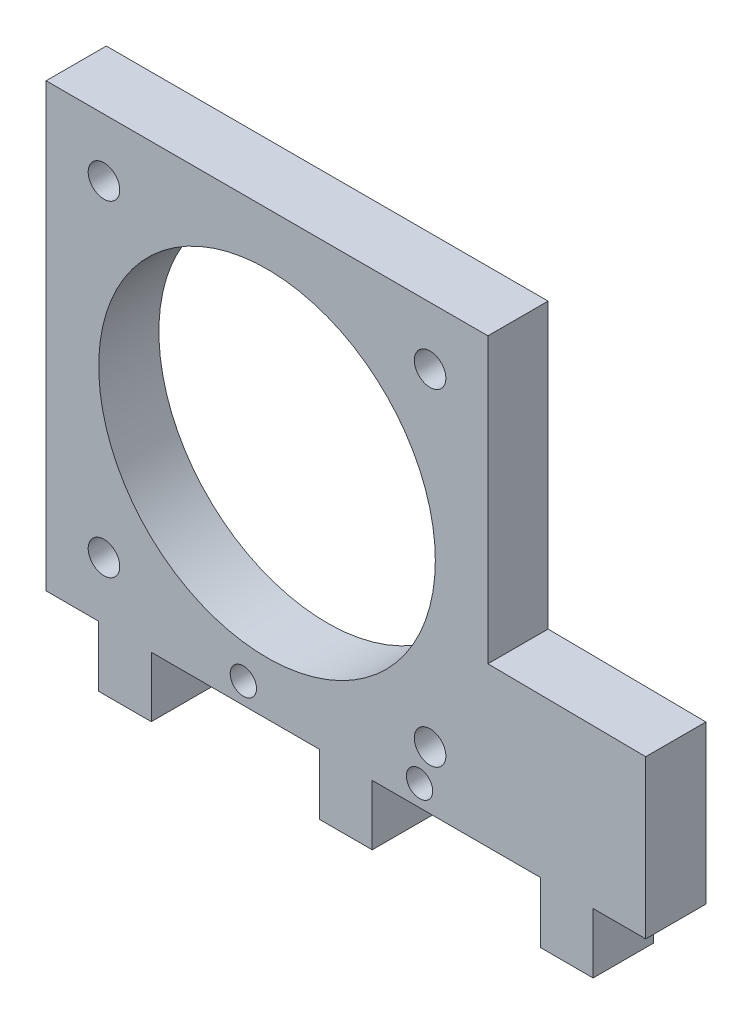
ISO-10303-21;
HEADER;
FILE_DESCRIPTION(('STEP AP214'),'2;1');
FILE_NAME('part.step','',(''),(''),'','','');
FILE_SCHEMA(('AUTOMOTIVE_DESIGN { 1 0 10303 214 1 1 1 1 }'));
ENDSEC;
DATA;
#1=APPLICATION_CONTEXT('core data for automotive mechanical design processes');
#2=APPLICATION_PROTOCOL_DEFINITION('international standard','automotive_design',2000,#1);
#3=PRODUCT_CONTEXT('',#1,'mechanical');
#4=PRODUCT('Part','Part','',(#3));
#5=PRODUCT_RELATED_PRODUCT_CATEGORY('part','',(#4));
#6=PRODUCT_DEFINITION_FORMATION('','',#4);
#7=PRODUCT_DEFINITION_CONTEXT('part definition',#1,'design');
#8=PRODUCT_DEFINITION('design','',#6,#7);
#9=PRODUCT_DEFINITION_SHAPE('','',#8);
#10=(LENGTH_UNIT() NAMED_UNIT(*) SI_UNIT(.MILLI.,.METRE.));
#11=(NAMED_UNIT(*) PLANE_ANGLE_UNIT() SI_UNIT($,.RADIAN.));
#12=(NAMED_UNIT(*) SI_UNIT($,.STERADIAN.) SOLID_ANGLE_UNIT());
#13=UNCERTAINTY_MEASURE_WITH_UNIT(LENGTH_MEASURE(1.E-05),#10,'distance_accuracy_value','');
#14=(GEOMETRIC_REPRESENTATION_CONTEXT(3) GLOBAL_UNCERTAINTY_ASSIGNED_CONTEXT((#13)) GLOBAL_UNIT_ASSIGNED_CONTEXT((#10,
#11,#12)) REPRESENTATION_CONTEXT('',''));
#15=CARTESIAN_POINT('',(0.,0.,0.));
#16=DIRECTION('',(0.,0.,1.));
#17=DIRECTION('',(1.,0.,0.));
#18=AXIS2_PLACEMENT_3D('',#15,#16,#17);
#19=CARTESIAN_POINT('',(0.,0.,5.72));
#20=DIRECTION('',(0.,0.,1.));
#21=DIRECTION('',(1.,0.,0.));
#22=AXIS2_PLACEMENT_3D('',#19,#20,#21);
#23=PLANE('',#22);
#24=CARTESIAN_POINT('',(-27.12,26.6479389312977,5.72));
#25=DIRECTION('',(0.,0.,1.));
#26=DIRECTION('',(1.,0.,0.));
#27=AXIS2_PLACEMENT_3D('',#24,#25,#26);
#28=CIRCLE('',#27,1.5);
#29=CARTESIAN_POINT('',(-25.62,26.6479389312977,5.72));
#30=VERTEX_POINT('',#29);
#31=EDGE_CURVE('E381',#30,#30,#28,.T.);
#32=ORIENTED_EDGE('',*,*,#31,.F.);
#33=EDGE_LOOP('',(#32));
#34=FACE_BOUND('',#33,.T.);
#35=CARTESIAN_POINT('',(-13.87,-7.90137404580153,5.72));
#36=DIRECTION('',(0.,0.,1.));
#37=DIRECTION('',(1.,0.,0.));
#38=AXIS2_PLACEMENT_3D('',#35,#36,#37);
#39=CIRCLE('',#38,1.25);
#40=CARTESIAN_POINT('',(-12.62,-7.90137404580153,5.72));
#41=VERTEX_POINT('',#40);
#42=EDGE_CURVE('E393',#41,#41,#39,.T.);
#43=ORIENTED_EDGE('',*,*,#42,.F.);
#44=EDGE_LOOP('',(#43));
#45=FACE_BOUND('',#44,.T.);
#46=CARTESIAN_POINT('',(3.87984311123458,-4.45068702290077,5.72));
#47=DIRECTION('',(0.,0.,1.));
#48=DIRECTION('',(1.,0.,0.));
#49=AXIS2_PLACEMENT_3D('',#46,#47,#48);
#50=CIRCLE('',#49,1.5);
#51=CARTESIAN_POINT('',(5.37984311123458,-4.45068702290077,5.72));
#52=VERTEX_POINT('',#51);
#53=EDGE_CURVE('E405',#52,#52,#50,.T.);
#54=ORIENTED_EDGE('',*,*,#53,.F.);
#55=EDGE_LOOP('',(#54));
#56=FACE_BOUND('',#55,.T.);
#57=DIRECTION('',(-0.999951368153607,0.00986211578362053,0.));
#58=VECTOR('',#57,1.);
#59=CARTESIAN_POINT('',(9.38,5.14793893129769,5.72));
#60=LINE('',#59,#58);
#61=CARTESIAN_POINT('',(24.38,5.,5.72));
#62=VERTEX_POINT('',#61);
#63=CARTESIAN_POINT('',(9.38,5.14793893129769,5.72));
#64=VERTEX_POINT('',#63);
#65=EDGE_CURVE('E225',#62,#64,#60,.T.);
#66=ORIENTED_EDGE('',*,*,#65,.T.);
#67=DIRECTION('',(0.,1.,0.));
#68=VECTOR('',#67,1.);
#69=CARTESIAN_POINT('',(9.38,32.1479389312977,5.72));
#70=LINE('',#69,#68);
#71=CARTESIAN_POINT('',(9.38,32.1479389312977,5.72));
#72=VERTEX_POINT('',#71);
#73=EDGE_CURVE('E123',#64,#72,#70,.T.);
#74=ORIENTED_EDGE('',*,*,#73,.T.);
#75=DIRECTION('',(-1.,0.,0.));
#76=VECTOR('',#75,1.);
#77=CARTESIAN_POINT('',(-32.62,32.1479389312977,5.72));
#78=LINE('',#77,#76);
#79=CARTESIAN_POINT('',(-32.62,32.1479389312977,5.72));
#80=VERTEX_POINT('',#79);
#81=EDGE_CURVE('E270',#72,#80,#78,.T.);
#82=ORIENTED_EDGE('',*,*,#81,.T.);
#83=DIRECTION('',(0.,-1.,0.));
#84=VECTOR('',#83,1.);
#85=CARTESIAN_POINT('',(-32.62,-9.85206106870231,5.72));
#86=LINE('',#85,#84);
#87=CARTESIAN_POINT('',(-32.62,-9.85206106870231,5.72));
#88=VERTEX_POINT('',#87);
#89=EDGE_CURVE('E289',#80,#88,#86,.T.);
#90=ORIENTED_EDGE('',*,*,#89,.T.);
#91=DIRECTION('',(1.,0.,0.));
#92=VECTOR('',#91,1.);
#93=CARTESIAN_POINT('',(-27.62,-9.85206106870231,5.72));
#94=LINE('',#93,#92);
#95=CARTESIAN_POINT('',(-27.62,-9.85206106870231,5.72));
#96=VERTEX_POINT('',#95);
#97=EDGE_CURVE('E286',#88,#96,#94,.T.);
#98=ORIENTED_EDGE('',*,*,#97,.T.);
#99=DIRECTION('',(0.,-1.,0.));
#100=VECTOR('',#99,1.);
#101=CARTESIAN_POINT('',(-27.62,-15.6213740458015,5.72));
#102=LINE('',#101,#100);
#103=CARTESIAN_POINT('',(-27.62,-15.6213740458015,5.72));
#104=VERTEX_POINT('',#103);
#105=EDGE_CURVE('E288',#96,#104,#102,.T.);
#106=ORIENTED_EDGE('',*,*,#105,.T.);
#107=DIRECTION('',(1.,0.,0.));
#108=VECTOR('',#107,1.);
#109=CARTESIAN_POINT('',(-22.62,-15.6213740458015,5.72));
#110=LINE('',#109,#108);
#111=CARTESIAN_POINT('',(-22.62,-15.6213740458015,5.72));
#112=VERTEX_POINT('',#111);
#113=EDGE_CURVE('E291',#104,#112,#110,.T.);
#114=ORIENTED_EDGE('',*,*,#113,.T.);
#115=DIRECTION('',(0.,1.,0.));
#116=VECTOR('',#115,1.);
#117=CARTESIAN_POINT('',(-22.62,-9.90137404580153,5.72));
#118=LINE('',#117,#116);
#119=CARTESIAN_POINT('',(-22.62,-9.90137404580153,5.72));
#120=VERTEX_POINT('',#119);
#121=EDGE_CURVE('E297',#112,#120,#118,.T.);
#122=ORIENTED_EDGE('',*,*,#121,.T.);
#123=DIRECTION('',(1.,0.,0.));
#124=VECTOR('',#123,1.);
#125=CARTESIAN_POINT('',(-6.62,-9.90137404580153,5.72));
#126=LINE('',#125,#124);
#127=CARTESIAN_POINT('',(-6.62,-9.90137404580153,5.72));
#128=VERTEX_POINT('',#127);
#129=EDGE_CURVE('E299',#120,#128,#126,.T.);
#130=ORIENTED_EDGE('',*,*,#129,.T.);
#131=DIRECTION('',(0.,-1.,0.));
#132=VECTOR('',#131,1.);
#133=CARTESIAN_POINT('',(-6.62,-15.6706870229008,5.72));
#134=LINE('',#133,#132);
#135=CARTESIAN_POINT('',(-6.62,-15.6706870229008,5.72));
#136=VERTEX_POINT('',#135);
#137=EDGE_CURVE('E301',#128,#136,#134,.T.);
#138=ORIENTED_EDGE('',*,*,#137,.T.);
#139=DIRECTION('',(1.,0.,0.));
#140=VECTOR('',#139,1.);
#141=CARTESIAN_POINT('',(-1.62,-15.6706870229008,5.72));
#142=LINE('',#141,#140);
#143=CARTESIAN_POINT('',(-1.62,-15.6706870229008,5.72));
#144=VERTEX_POINT('',#143);
#145=EDGE_CURVE('E303',#136,#144,#142,.T.);
#146=ORIENTED_EDGE('',*,*,#145,.T.);
#147=DIRECTION('',(0.,1.,0.));
#148=VECTOR('',#147,1.);
#149=CARTESIAN_POINT('',(-1.62,-9.95068702290077,5.72));
#150=LINE('',#149,#148);
#151=CARTESIAN_POINT('',(-1.62,-9.95068702290077,5.72));
#152=VERTEX_POINT('',#151);
#153=EDGE_CURVE('E305',#144,#152,#150,.T.);
#154=ORIENTED_EDGE('',*,*,#153,.T.);
#155=DIRECTION('',(1.,0.,0.));
#156=VECTOR('',#155,1.);
#157=CARTESIAN_POINT('',(14.38,-9.95068702290077,5.72));
#158=LINE('',#157,#156);
#159=CARTESIAN_POINT('',(14.38,-9.95068702290077,5.72));
#160=VERTEX_POINT('',#159);
#161=EDGE_CURVE('E307',#152,#160,#158,.T.);
#162=ORIENTED_EDGE('',*,*,#161,.T.);
#163=DIRECTION('',(0.,-1.,0.));
#164=VECTOR('',#163,1.);
#165=CARTESIAN_POINT('',(14.38,-15.72,5.72));
#166=LINE('',#165,#164);
#167=CARTESIAN_POINT('',(14.38,-15.72,5.72));
#168=VERTEX_POINT('',#167);
#169=EDGE_CURVE('E309',#160,#168,#166,.T.);
#170=ORIENTED_EDGE('',*,*,#169,.T.);
#171=DIRECTION('',(1.,0.,0.));
#172=VECTOR('',#171,1.);
#173=CARTESIAN_POINT('',(19.38,-15.72,5.72));
#174=LINE('',#173,#172);
#175=CARTESIAN_POINT('',(19.38,-15.72,5.72));
#176=VERTEX_POINT('',#175);
#177=EDGE_CURVE('E172',#168,#176,#174,.T.);
#178=ORIENTED_EDGE('',*,*,#177,.T.);
#179=DIRECTION('',(0.,1.,0.));
#180=VECTOR('',#179,1.);
#181=CARTESIAN_POINT('',(19.38,-10.,5.72));
#182=LINE('',#181,#180);
#183=CARTESIAN_POINT('',(19.38,-10.,5.72));
#184=VERTEX_POINT('',#183);
#185=EDGE_CURVE('E166',#176,#184,#182,.T.);
#186=ORIENTED_EDGE('',*,*,#185,.T.);
#187=DIRECTION('',(1.,0.,0.));
#188=VECTOR('',#187,1.);
#189=CARTESIAN_POINT('',(24.38,-10.,5.72));
#190=LINE('',#189,#188);
#191=CARTESIAN_POINT('',(24.38,-10.,5.72));
#192=VERTEX_POINT('',#191);
#193=EDGE_CURVE('E170',#184,#192,#190,.T.);
#194=ORIENTED_EDGE('',*,*,#193,.T.);
#195=DIRECTION('',(0.,1.,0.));
#196=VECTOR('',#195,1.);
#197=CARTESIAN_POINT('',(24.38,-10.,5.72));
#198=LINE('',#197,#196);
#199=EDGE_CURVE('E50',#192,#62,#198,.T.);
#200=ORIENTED_EDGE('',*,*,#199,.T.);
#201=EDGE_LOOP('',(#66,#74,#82,#90,#98,#106,#114,#122,#130,#138,#146,#154,#162,#170,#178,#186,
#194,#200));
#202=FACE_BOUND('',#201,.T.);
#203=CARTESIAN_POINT('',(-11.62,11.1479389312977,5.72));
#204=DIRECTION('',(0.,0.,1.));
#205=DIRECTION('',(1.,0.,0.));
#206=AXIS2_PLACEMENT_3D('',#203,#204,#205);
#207=CIRCLE('',#206,16.);
#208=CARTESIAN_POINT('',(4.38,11.1479389312977,5.72));
#209=VERTEX_POINT('',#208);
#210=EDGE_CURVE('E194',#209,#209,#207,.T.);
#211=ORIENTED_EDGE('',*,*,#210,.F.);
#212=EDGE_LOOP('',(#211));
#213=FACE_BOUND('',#212,.T.);
#214=CARTESIAN_POINT('',(2.88,-7.95068702290077,5.72));
#215=DIRECTION('',(0.,0.,1.));
#216=DIRECTION('',(1.,0.,0.));
#217=AXIS2_PLACEMENT_3D('',#214,#215,#216);
#218=CIRCLE('',#217,1.25);
#219=CARTESIAN_POINT('',(4.13,-7.95068702290077,5.72));
#220=VERTEX_POINT('',#219);
#221=EDGE_CURVE('E399',#220,#220,#218,.T.);
#222=ORIENTED_EDGE('',*,*,#221,.F.);
#223=EDGE_LOOP('',(#222));
#224=FACE_BOUND('',#223,.T.);
#225=CARTESIAN_POINT('',(-27.12,-4.35206106870231,5.72));
#226=DIRECTION('',(0.,0.,1.));
#227=DIRECTION('',(1.,0.,0.));
#228=AXIS2_PLACEMENT_3D('',#225,#226,#227);
#229=CIRCLE('',#228,1.5);
#230=CARTESIAN_POINT('',(-25.62,-4.35206106870231,5.72));
#231=VERTEX_POINT('',#230);
#232=EDGE_CURVE('E387',#231,#231,#229,.T.);
#233=ORIENTED_EDGE('',*,*,#232,.F.);
#234=EDGE_LOOP('',(#233));
#235=FACE_BOUND('',#234,.T.);
#236=CARTESIAN_POINT('',(3.88,26.6479389312977,5.72));
#237=DIRECTION('',(0.,0.,1.));
#238=DIRECTION('',(1.,0.,0.));
#239=AXIS2_PLACEMENT_3D('',#236,#237,#238);
#240=CIRCLE('',#239,1.5);
#241=CARTESIAN_POINT('',(5.38,26.6479389312977,5.72));
#242=VERTEX_POINT('',#241);
#243=EDGE_CURVE('E372',#242,#242,#240,.T.);
#244=ORIENTED_EDGE('',*,*,#243,.F.);
#245=EDGE_LOOP('',(#244));
#246=FACE_BOUND('',#245,.T.);
#247=ADVANCED_FACE('F33',(#34,#45,#56,#202,#213,#224,#235,#246),#23,.T.);
#248=CARTESIAN_POINT('',(0.,0.,0.));
#249=DIRECTION('',(0.,0.,1.));
#250=DIRECTION('',(1.,0.,0.));
#251=AXIS2_PLACEMENT_3D('',#248,#249,#250);
#252=PLANE('',#251);
#253=DIRECTION('',(-0.999951368153607,0.00986211578362053,0.));
#254=VECTOR('',#253,1.);
#255=CARTESIAN_POINT('',(9.38,5.14793893129769,0.));
#256=LINE('',#255,#254);
#257=CARTESIAN_POINT('',(24.38,5.,0.));
#258=VERTEX_POINT('',#257);
#259=CARTESIAN_POINT('',(9.38,5.14793893129769,0.));
#260=VERTEX_POINT('',#259);
#261=EDGE_CURVE('E190',#258,#260,#256,.T.);
#262=ORIENTED_EDGE('',*,*,#261,.F.);
#263=DIRECTION('',(0.,1.,0.));
#264=VECTOR('',#263,1.);
#265=CARTESIAN_POINT('',(24.38,-10.,0.));
#266=LINE('',#265,#264);
#267=CARTESIAN_POINT('',(24.38,-10.,0.));
#268=VERTEX_POINT('',#267);
#269=EDGE_CURVE('E115',#268,#258,#266,.T.);
#270=ORIENTED_EDGE('',*,*,#269,.F.);
#271=DIRECTION('',(1.,0.,0.));
#272=VECTOR('',#271,1.);
#273=CARTESIAN_POINT('',(24.38,-10.,0.));
#274=LINE('',#273,#272);
#275=CARTESIAN_POINT('',(19.38,-10.,0.));
#276=VERTEX_POINT('',#275);
#277=EDGE_CURVE('E109',#276,#268,#274,.T.);
#278=ORIENTED_EDGE('',*,*,#277,.F.);
#279=DIRECTION('',(0.,1.,0.));
#280=VECTOR('',#279,1.);
#281=CARTESIAN_POINT('',(19.38,-10.,0.));
#282=LINE('',#281,#280);
#283=CARTESIAN_POINT('',(19.38,-15.72,0.));
#284=VERTEX_POINT('',#283);
#285=EDGE_CURVE('E180',#284,#276,#282,.T.);
#286=ORIENTED_EDGE('',*,*,#285,.F.);
#287=DIRECTION('',(1.,0.,0.));
#288=VECTOR('',#287,1.);
#289=CARTESIAN_POINT('',(19.38,-15.72,0.));
#290=LINE('',#289,#288);
#291=CARTESIAN_POINT('',(14.38,-15.72,0.));
#292=VERTEX_POINT('',#291);
#293=EDGE_CURVE('E220',#292,#284,#290,.T.);
#294=ORIENTED_EDGE('',*,*,#293,.F.);
#295=DIRECTION('',(0.,-1.,0.));
#296=VECTOR('',#295,1.);
#297=CARTESIAN_POINT('',(14.38,-15.72,0.));
#298=LINE('',#297,#296);
#299=CARTESIAN_POINT('',(14.38,-9.95068702290077,0.));
#300=VERTEX_POINT('',#299);
#301=EDGE_CURVE('E218',#300,#292,#298,.T.);
#302=ORIENTED_EDGE('',*,*,#301,.F.);
#303=DIRECTION('',(1.,0.,0.));
#304=VECTOR('',#303,1.);
#305=CARTESIAN_POINT('',(14.38,-9.95068702290077,0.));
#306=LINE('',#305,#304);
#307=CARTESIAN_POINT('',(-1.62,-9.95068702290077,0.));
#308=VERTEX_POINT('',#307);
#309=EDGE_CURVE('E216',#308,#300,#306,.T.);
#310=ORIENTED_EDGE('',*,*,#309,.F.);
#311=DIRECTION('',(0.,1.,0.));
#312=VECTOR('',#311,1.);
#313=CARTESIAN_POINT('',(-1.62,-9.95068702290077,0.));
#314=LINE('',#313,#312);
#315=CARTESIAN_POINT('',(-1.62,-15.6706870229008,0.));
#316=VERTEX_POINT('',#315);
#317=EDGE_CURVE('E214',#316,#308,#314,.T.);
#318=ORIENTED_EDGE('',*,*,#317,.F.);
#319=DIRECTION('',(1.,0.,0.));
#320=VECTOR('',#319,1.);
#321=CARTESIAN_POINT('',(-1.62,-15.6706870229008,0.));
#322=LINE('',#321,#320);
#323=CARTESIAN_POINT('',(-6.62,-15.6706870229008,0.));
#324=VERTEX_POINT('',#323);
#325=EDGE_CURVE('E212',#324,#316,#322,.T.);
#326=ORIENTED_EDGE('',*,*,#325,.F.);
#327=DIRECTION('',(0.,-1.,0.));
#328=VECTOR('',#327,1.);
#329=CARTESIAN_POINT('',(-6.62,-15.6706870229008,0.));
#330=LINE('',#329,#328);
#331=CARTESIAN_POINT('',(-6.62,-9.90137404580153,0.));
#332=VERTEX_POINT('',#331);
#333=EDGE_CURVE('E210',#332,#324,#330,.T.);
#334=ORIENTED_EDGE('',*,*,#333,.F.);
#335=DIRECTION('',(1.,0.,0.));
#336=VECTOR('',#335,1.);
#337=CARTESIAN_POINT('',(-6.62,-9.90137404580153,0.));
#338=LINE('',#337,#336);
#339=CARTESIAN_POINT('',(-22.62,-9.90137404580153,0.));
#340=VERTEX_POINT('',#339);
#341=EDGE_CURVE('E208',#340,#332,#338,.T.);
#342=ORIENTED_EDGE('',*,*,#341,.F.);
#343=DIRECTION('',(0.,1.,0.));
#344=VECTOR('',#343,1.);
#345=CARTESIAN_POINT('',(-22.62,-9.90137404580153,0.));
#346=LINE('',#345,#344);
#347=CARTESIAN_POINT('',(-22.62,-15.6213740458015,0.));
#348=VERTEX_POINT('',#347);
#349=EDGE_CURVE('E206',#348,#340,#346,.T.);
#350=ORIENTED_EDGE('',*,*,#349,.F.);
#351=DIRECTION('',(1.,0.,0.));
#352=VECTOR('',#351,1.);
#353=CARTESIAN_POINT('',(-22.62,-15.6213740458015,0.));
#354=LINE('',#353,#352);
#355=CARTESIAN_POINT('',(-27.62,-15.6213740458015,0.));
#356=VERTEX_POINT('',#355);
#357=EDGE_CURVE('E204',#356,#348,#354,.T.);
#358=ORIENTED_EDGE('',*,*,#357,.F.);
#359=DIRECTION('',(0.,-1.,0.));
#360=VECTOR('',#359,1.);
#361=CARTESIAN_POINT('',(-27.62,-15.6213740458015,0.));
#362=LINE('',#361,#360);
#363=CARTESIAN_POINT('',(-27.62,-9.85206106870231,0.));
#364=VERTEX_POINT('',#363);
#365=EDGE_CURVE('E202',#364,#356,#362,.T.);
#366=ORIENTED_EDGE('',*,*,#365,.F.);
#367=DIRECTION('',(1.,0.,0.));
#368=VECTOR('',#367,1.);
#369=CARTESIAN_POINT('',(-27.62,-9.85206106870231,0.));
#370=LINE('',#369,#368);
#371=CARTESIAN_POINT('',(-32.62,-9.85206106870231,0.));
#372=VERTEX_POINT('',#371);
#373=EDGE_CURVE('E200',#372,#364,#370,.T.);
#374=ORIENTED_EDGE('',*,*,#373,.F.);
#375=DIRECTION('',(0.,-1.,0.));
#376=VECTOR('',#375,1.);
#377=CARTESIAN_POINT('',(-32.62,-9.85206106870231,0.));
#378=LINE('',#377,#376);
#379=CARTESIAN_POINT('',(-32.62,32.1479389312977,0.));
#380=VERTEX_POINT('',#379);
#381=EDGE_CURVE('E198',#380,#372,#378,.T.);
#382=ORIENTED_EDGE('',*,*,#381,.F.);
#383=DIRECTION('',(-1.,0.,0.));
#384=VECTOR('',#383,1.);
#385=CARTESIAN_POINT('',(-32.62,32.1479389312977,0.));
#386=LINE('',#385,#384);
#387=CARTESIAN_POINT('',(9.38,32.1479389312977,0.));
#388=VERTEX_POINT('',#387);
#389=EDGE_CURVE('E196',#388,#380,#386,.T.);
#390=ORIENTED_EDGE('',*,*,#389,.F.);
#391=DIRECTION('',(0.,1.,0.));
#392=VECTOR('',#391,1.);
#393=CARTESIAN_POINT('',(9.38,32.1479389312977,0.));
#394=LINE('',#393,#392);
#395=EDGE_CURVE('E193',#260,#388,#394,.T.);
#396=ORIENTED_EDGE('',*,*,#395,.F.);
#397=EDGE_LOOP('',(#262,#270,#278,#286,#294,#302,#310,#318,#326,#334,#342,#350,#358,#366,#374,
#382,#390,#396));
#398=FACE_BOUND('',#397,.T.);
#399=CARTESIAN_POINT('',(-11.62,11.1479389312977,0.));
#400=DIRECTION('',(0.,0.,1.));
#401=DIRECTION('',(1.,0.,0.));
#402=AXIS2_PLACEMENT_3D('',#399,#400,#401);
#403=CIRCLE('',#402,16.);
#404=CARTESIAN_POINT('',(4.38,11.1479389312977,0.));
#405=VERTEX_POINT('',#404);
#406=EDGE_CURVE('E408',#405,#405,#403,.T.);
#407=ORIENTED_EDGE('',*,*,#406,.T.);
#408=EDGE_LOOP('',(#407));
#409=FACE_BOUND('',#408,.T.);
#410=CARTESIAN_POINT('',(3.87984311123458,-4.45068702290077,0.));
#411=DIRECTION('',(0.,0.,1.));
#412=DIRECTION('',(1.,0.,0.));
#413=AXIS2_PLACEMENT_3D('',#410,#411,#412);
#414=CIRCLE('',#413,1.5);
#415=CARTESIAN_POINT('',(5.37984311123458,-4.45068702290077,0.));
#416=VERTEX_POINT('',#415);
#417=EDGE_CURVE('E402',#416,#416,#414,.T.);
#418=ORIENTED_EDGE('',*,*,#417,.T.);
#419=EDGE_LOOP('',(#418));
#420=FACE_BOUND('',#419,.T.);
#421=CARTESIAN_POINT('',(2.88,-7.95068702290077,0.));
#422=DIRECTION('',(0.,0.,1.));
#423=DIRECTION('',(1.,0.,0.));
#424=AXIS2_PLACEMENT_3D('',#421,#422,#423);
#425=CIRCLE('',#424,1.25);
#426=CARTESIAN_POINT('',(4.13,-7.95068702290077,0.));
#427=VERTEX_POINT('',#426);
#428=EDGE_CURVE('E396',#427,#427,#425,.T.);
#429=ORIENTED_EDGE('',*,*,#428,.T.);
#430=EDGE_LOOP('',(#429));
#431=FACE_BOUND('',#430,.T.);
#432=CARTESIAN_POINT('',(-13.87,-7.90137404580153,0.));
#433=DIRECTION('',(0.,0.,1.));
#434=DIRECTION('',(1.,0.,0.));
#435=AXIS2_PLACEMENT_3D('',#432,#433,#434);
#436=CIRCLE('',#435,1.25);
#437=CARTESIAN_POINT('',(-12.62,-7.90137404580153,0.));
#438=VERTEX_POINT('',#437);
#439=EDGE_CURVE('E390',#438,#438,#436,.T.);
#440=ORIENTED_EDGE('',*,*,#439,.T.);
#441=EDGE_LOOP('',(#440));
#442=FACE_BOUND('',#441,.T.);
#443=CARTESIAN_POINT('',(-27.12,-4.35206106870231,0.));
#444=DIRECTION('',(0.,0.,1.));
#445=DIRECTION('',(1.,0.,0.));
#446=AXIS2_PLACEMENT_3D('',#443,#444,#445);
#447=CIRCLE('',#446,1.5);
#448=CARTESIAN_POINT('',(-25.62,-4.35206106870231,0.));
#449=VERTEX_POINT('',#448);
#450=EDGE_CURVE('E384',#449,#449,#447,.T.);
#451=ORIENTED_EDGE('',*,*,#450,.T.);
#452=EDGE_LOOP('',(#451));
#453=FACE_BOUND('',#452,.T.);
#454=CARTESIAN_POINT('',(-27.12,26.6479389312977,0.));
#455=DIRECTION('',(0.,0.,1.));
#456=DIRECTION('',(1.,0.,0.));
#457=AXIS2_PLACEMENT_3D('',#454,#455,#456);
#458=CIRCLE('',#457,1.5);
#459=CARTESIAN_POINT('',(-25.62,26.6479389312977,0.));
#460=VERTEX_POINT('',#459);
#461=EDGE_CURVE('E378',#460,#460,#458,.T.);
#462=ORIENTED_EDGE('',*,*,#461,.T.);
#463=EDGE_LOOP('',(#462));
#464=FACE_BOUND('',#463,.T.);
#465=CARTESIAN_POINT('',(3.88,26.6479389312977,0.));
#466=DIRECTION('',(0.,0.,1.));
#467=DIRECTION('',(1.,0.,0.));
#468=AXIS2_PLACEMENT_3D('',#465,#466,#467);
#469=CIRCLE('',#468,1.5);
#470=CARTESIAN_POINT('',(5.38,26.6479389312977,0.));
#471=VERTEX_POINT('',#470);
#472=EDGE_CURVE('E375',#471,#471,#469,.T.);
#473=ORIENTED_EDGE('',*,*,#472,.T.);
#474=EDGE_LOOP('',(#473));
#475=FACE_BOUND('',#474,.T.);
#476=ADVANCED_FACE('F274',(#398,#409,#420,#431,#442,#453,#464,#475),#252,.F.);
#477=CARTESIAN_POINT('',(9.38,5.14793893129769,5.72));
#478=DIRECTION('',(-0.00986211578362053,-0.999951368153607,0.));
#479=DIRECTION('',(0.999951368153607,-0.00986211578362053,0.));
#480=AXIS2_PLACEMENT_3D('',#477,#478,#479);
#481=PLANE('',#480);
#482=ORIENTED_EDGE('',*,*,#261,.T.);
#483=DIRECTION('',(0.,0.,-1.));
#484=VECTOR('',#483,1.);
#485=CARTESIAN_POINT('',(9.38,5.14793893129769,5.72));
#486=LINE('',#485,#484);
#487=EDGE_CURVE('E11',#64,#260,#486,.T.);
#488=ORIENTED_EDGE('',*,*,#487,.F.);
#489=ORIENTED_EDGE('',*,*,#65,.F.);
#490=DIRECTION('',(0.,0.,-1.));
#491=VECTOR('',#490,1.);
#492=CARTESIAN_POINT('',(24.38,5.,5.72));
#493=LINE('',#492,#491);
#494=EDGE_CURVE('E186',#62,#258,#493,.T.);
#495=ORIENTED_EDGE('',*,*,#494,.T.);
#496=EDGE_LOOP('',(#482,#488,#489,#495));
#497=FACE_BOUND('',#496,.T.);
#498=ADVANCED_FACE('F35',(#497),#481,.F.);
#499=CARTESIAN_POINT('',(9.38,32.1479389312977,5.72));
#500=DIRECTION('',(-1.,0.,0.));
#501=DIRECTION('',(0.,-1.,0.));
#502=AXIS2_PLACEMENT_3D('',#499,#500,#501);
#503=PLANE('',#502);
#504=ORIENTED_EDGE('',*,*,#395,.T.);
#505=DIRECTION('',(0.,0.,-1.));
#506=VECTOR('',#505,1.);
#507=CARTESIAN_POINT('',(9.38,32.1479389312977,5.72));
#508=LINE('',#507,#506);
#509=EDGE_CURVE('E42',#72,#388,#508,.T.);
#510=ORIENTED_EDGE('',*,*,#509,.F.);
#511=ORIENTED_EDGE('',*,*,#73,.F.);
#512=ORIENTED_EDGE('',*,*,#487,.T.);
#513=EDGE_LOOP('',(#504,#510,#511,#512));
#514=FACE_BOUND('',#513,.T.);
#515=ADVANCED_FACE('F605',(#514),#503,.F.);
#516=CARTESIAN_POINT('',(-32.62,32.1479389312977,5.72));
#517=DIRECTION('',(0.,-1.,0.));
#518=DIRECTION('',(0.,0.,-1.));
#519=AXIS2_PLACEMENT_3D('',#516,#517,#518);
#520=PLANE('',#519);
#521=ORIENTED_EDGE('',*,*,#389,.T.);
#522=DIRECTION('',(0.,0.,-1.));
#523=VECTOR('',#522,1.);
#524=CARTESIAN_POINT('',(-32.62,32.1479389312977,5.72));
#525=LINE('',#524,#523);
#526=EDGE_CURVE('E262',#80,#380,#525,.T.);
#527=ORIENTED_EDGE('',*,*,#526,.F.);
#528=ORIENTED_EDGE('',*,*,#81,.F.);
#529=ORIENTED_EDGE('',*,*,#509,.T.);
#530=EDGE_LOOP('',(#521,#527,#528,#529));
#531=FACE_BOUND('',#530,.T.);
#532=ADVANCED_FACE('F268',(#531),#520,.F.);
#533=CARTESIAN_POINT('',(-32.62,-9.85206106870231,5.72));
#534=DIRECTION('',(1.,0.,0.));
#535=DIRECTION('',(0.,0.,-1.));
#536=AXIS2_PLACEMENT_3D('',#533,#534,#535);
#537=PLANE('',#536);
#538=ORIENTED_EDGE('',*,*,#381,.T.);
#539=DIRECTION('',(0.,0.,-1.));
#540=VECTOR('',#539,1.);
#541=CARTESIAN_POINT('',(-32.62,-9.85206106870231,5.72));
#542=LINE('',#541,#540);
#543=EDGE_CURVE('E259',#88,#372,#542,.T.);
#544=ORIENTED_EDGE('',*,*,#543,.F.);
#545=ORIENTED_EDGE('',*,*,#89,.F.);
#546=ORIENTED_EDGE('',*,*,#526,.T.);
#547=EDGE_LOOP('',(#538,#544,#545,#546));
#548=FACE_BOUND('',#547,.T.);
#549=ADVANCED_FACE('F280',(#548),#537,.F.);
#550=CARTESIAN_POINT('',(-27.62,-9.85206106870231,5.72));
#551=DIRECTION('',(0.,1.,0.));
#552=DIRECTION('',(-1.,0.,0.));
#553=AXIS2_PLACEMENT_3D('',#550,#551,#552);
#554=PLANE('',#553);
#555=ORIENTED_EDGE('',*,*,#373,.T.);
#556=DIRECTION('',(0.,0.,-1.));
#557=VECTOR('',#556,1.);
#558=CARTESIAN_POINT('',(-27.62,-9.85206106870231,5.72));
#559=LINE('',#558,#557);
#560=EDGE_CURVE('E256',#96,#364,#559,.T.);
#561=ORIENTED_EDGE('',*,*,#560,.F.);
#562=ORIENTED_EDGE('',*,*,#97,.F.);
#563=ORIENTED_EDGE('',*,*,#543,.T.);
#564=EDGE_LOOP('',(#555,#561,#562,#563));
#565=FACE_BOUND('',#564,.T.);
#566=ADVANCED_FACE('F284',(#565),#554,.F.);
#567=CARTESIAN_POINT('',(-27.62,-15.6213740458015,5.72));
#568=DIRECTION('',(1.,0.,0.));
#569=DIRECTION('',(0.,0.,-1.));
#570=AXIS2_PLACEMENT_3D('',#567,#568,#569);
#571=PLANE('',#570);
#572=ORIENTED_EDGE('',*,*,#365,.T.);
#573=DIRECTION('',(0.,0.,-1.));
#574=VECTOR('',#573,1.);
#575=CARTESIAN_POINT('',(-27.62,-15.6213740458015,5.72));
#576=LINE('',#575,#574);
#577=EDGE_CURVE('E253',#104,#356,#576,.T.);
#578=ORIENTED_EDGE('',*,*,#577,.F.);
#579=ORIENTED_EDGE('',*,*,#105,.F.);
#580=ORIENTED_EDGE('',*,*,#560,.T.);
#581=EDGE_LOOP('',(#572,#578,#579,#580));
#582=FACE_BOUND('',#581,.T.);
#583=ADVANCED_FACE('F570',(#582),#571,.F.);
#584=CARTESIAN_POINT('',(-22.62,-15.6213740458015,5.72));
#585=DIRECTION('',(0.,1.,0.));
#586=DIRECTION('',(0.,0.,1.));
#587=AXIS2_PLACEMENT_3D('',#584,#585,#586);
#588=PLANE('',#587);
#589=ORIENTED_EDGE('',*,*,#357,.T.);
#590=DIRECTION('',(0.,0.,-1.));
#591=VECTOR('',#590,1.);
#592=CARTESIAN_POINT('',(-22.62,-15.6213740458015,5.72));
#593=LINE('',#592,#591);
#594=EDGE_CURVE('E250',#112,#348,#593,.T.);
#595=ORIENTED_EDGE('',*,*,#594,.F.);
#596=ORIENTED_EDGE('',*,*,#113,.F.);
#597=ORIENTED_EDGE('',*,*,#577,.T.);
#598=EDGE_LOOP('',(#589,#595,#596,#597));
#599=FACE_BOUND('',#598,.T.);
#600=ADVANCED_FACE('F560',(#599),#588,.F.);
#601=CARTESIAN_POINT('',(-22.62,-9.90137404580153,5.72));
#602=DIRECTION('',(-1.,0.,0.));
#603=DIRECTION('',(0.,0.,1.));
#604=AXIS2_PLACEMENT_3D('',#601,#602,#603);
#605=PLANE('',#604);
#606=ORIENTED_EDGE('',*,*,#349,.T.);
#607=DIRECTION('',(0.,0.,-1.));
#608=VECTOR('',#607,1.);
#609=CARTESIAN_POINT('',(-22.62,-9.90137404580153,5.72));
#610=LINE('',#609,#608);
#611=EDGE_CURVE('E247',#120,#340,#610,.T.);
#612=ORIENTED_EDGE('',*,*,#611,.F.);
#613=ORIENTED_EDGE('',*,*,#121,.F.);
#614=ORIENTED_EDGE('',*,*,#594,.T.);
#615=EDGE_LOOP('',(#606,#612,#613,#614));
#616=FACE_BOUND('',#615,.T.);
#617=ADVANCED_FACE('F550',(#616),#605,.F.);
#618=CARTESIAN_POINT('',(-6.62,-9.90137404580153,5.72));
#619=DIRECTION('',(0.,1.,0.));
#620=DIRECTION('',(0.,0.,1.));
#621=AXIS2_PLACEMENT_3D('',#618,#619,#620);
#622=PLANE('',#621);
#623=ORIENTED_EDGE('',*,*,#341,.T.);
#624=DIRECTION('',(0.,0.,-1.));
#625=VECTOR('',#624,1.);
#626=CARTESIAN_POINT('',(-6.62,-9.90137404580153,5.72));
#627=LINE('',#626,#625);
#628=EDGE_CURVE('E244',#128,#332,#627,.T.);
#629=ORIENTED_EDGE('',*,*,#628,.F.);
#630=ORIENTED_EDGE('',*,*,#129,.F.);
#631=ORIENTED_EDGE('',*,*,#611,.T.);
#632=EDGE_LOOP('',(#623,#629,#630,#631));
#633=FACE_BOUND('',#632,.T.);
#634=ADVANCED_FACE('F540',(#633),#622,.F.);
#635=CARTESIAN_POINT('',(-6.62,-15.6706870229008,5.72));
#636=DIRECTION('',(1.,0.,0.));
#637=DIRECTION('',(0.,0.,-1.));
#638=AXIS2_PLACEMENT_3D('',#635,#636,#637);
#639=PLANE('',#638);
#640=ORIENTED_EDGE('',*,*,#333,.T.);
#641=DIRECTION('',(0.,0.,-1.));
#642=VECTOR('',#641,1.);
#643=CARTESIAN_POINT('',(-6.62,-15.6706870229008,5.72));
#644=LINE('',#643,#642);
#645=EDGE_CURVE('E241',#136,#324,#644,.T.);
#646=ORIENTED_EDGE('',*,*,#645,.F.);
#647=ORIENTED_EDGE('',*,*,#137,.F.);
#648=ORIENTED_EDGE('',*,*,#628,.T.);
#649=EDGE_LOOP('',(#640,#646,#647,#648));
#650=FACE_BOUND('',#649,.T.);
#651=ADVANCED_FACE('F530',(#650),#639,.F.);
#652=CARTESIAN_POINT('',(-1.62,-15.6706870229008,5.72));
#653=DIRECTION('',(0.,1.,0.));
#654=DIRECTION('',(0.,0.,1.));
#655=AXIS2_PLACEMENT_3D('',#652,#653,#654);
#656=PLANE('',#655);
#657=ORIENTED_EDGE('',*,*,#325,.T.);
#658=DIRECTION('',(0.,0.,-1.));
#659=VECTOR('',#658,1.);
#660=CARTESIAN_POINT('',(-1.62,-15.6706870229008,5.72));
#661=LINE('',#660,#659);
#662=EDGE_CURVE('E238',#144,#316,#661,.T.);
#663=ORIENTED_EDGE('',*,*,#662,.F.);
#664=ORIENTED_EDGE('',*,*,#145,.F.);
#665=ORIENTED_EDGE('',*,*,#645,.T.);
#666=EDGE_LOOP('',(#657,#663,#664,#665));
#667=FACE_BOUND('',#666,.T.);
#668=ADVANCED_FACE('F520',(#667),#656,.F.);
#669=CARTESIAN_POINT('',(-1.62,-9.95068702290077,5.72));
#670=DIRECTION('',(-1.,0.,0.));
#671=DIRECTION('',(0.,-1.,0.));
#672=AXIS2_PLACEMENT_3D('',#669,#670,#671);
#673=PLANE('',#672);
#674=ORIENTED_EDGE('',*,*,#317,.T.);
#675=DIRECTION('',(0.,0.,-1.));
#676=VECTOR('',#675,1.);
#677=CARTESIAN_POINT('',(-1.62,-9.95068702290077,5.72));
#678=LINE('',#677,#676);
#679=EDGE_CURVE('E235',#152,#308,#678,.T.);
#680=ORIENTED_EDGE('',*,*,#679,.F.);
#681=ORIENTED_EDGE('',*,*,#153,.F.);
#682=ORIENTED_EDGE('',*,*,#662,.T.);
#683=EDGE_LOOP('',(#674,#680,#681,#682));
#684=FACE_BOUND('',#683,.T.);
#685=ADVANCED_FACE('F510',(#684),#673,.F.);
#686=CARTESIAN_POINT('',(14.38,-9.95068702290077,5.72));
#687=DIRECTION('',(0.,1.,0.));
#688=DIRECTION('',(-1.,0.,0.));
#689=AXIS2_PLACEMENT_3D('',#686,#687,#688);
#690=PLANE('',#689);
#691=ORIENTED_EDGE('',*,*,#309,.T.);
#692=DIRECTION('',(0.,0.,-1.));
#693=VECTOR('',#692,1.);
#694=CARTESIAN_POINT('',(14.38,-9.95068702290077,5.72));
#695=LINE('',#694,#693);
#696=EDGE_CURVE('E232',#160,#300,#695,.T.);
#697=ORIENTED_EDGE('',*,*,#696,.F.);
#698=ORIENTED_EDGE('',*,*,#161,.F.);
#699=ORIENTED_EDGE('',*,*,#679,.T.);
#700=EDGE_LOOP('',(#691,#697,#698,#699));
#701=FACE_BOUND('',#700,.T.);
#702=ADVANCED_FACE('F501',(#701),#690,.F.);
#703=CARTESIAN_POINT('',(14.38,-15.72,5.72));
#704=DIRECTION('',(1.,0.,0.));
#705=DIRECTION('',(0.,0.,-1.));
#706=AXIS2_PLACEMENT_3D('',#703,#704,#705);
#707=PLANE('',#706);
#708=ORIENTED_EDGE('',*,*,#301,.T.);
#709=DIRECTION('',(0.,0.,-1.));
#710=VECTOR('',#709,1.);
#711=CARTESIAN_POINT('',(14.38,-15.72,5.72));
#712=LINE('',#711,#710);
#713=EDGE_CURVE('E229',#168,#292,#712,.T.);
#714=ORIENTED_EDGE('',*,*,#713,.F.);
#715=ORIENTED_EDGE('',*,*,#169,.F.);
#716=ORIENTED_EDGE('',*,*,#696,.T.);
#717=EDGE_LOOP('',(#708,#714,#715,#716));
#718=FACE_BOUND('',#717,.T.);
#719=ADVANCED_FACE('F315',(#718),#707,.F.);
#720=CARTESIAN_POINT('',(19.38,-15.72,5.72));
#721=DIRECTION('',(0.,1.,0.));
#722=DIRECTION('',(0.,0.,1.));
#723=AXIS2_PLACEMENT_3D('',#720,#721,#722);
#724=PLANE('',#723);
#725=ORIENTED_EDGE('',*,*,#293,.T.);
#726=DIRECTION('',(0.,0.,-1.));
#727=VECTOR('',#726,1.);
#728=CARTESIAN_POINT('',(19.38,-15.72,5.72));
#729=LINE('',#728,#727);
#730=EDGE_CURVE('E181',#176,#284,#729,.T.);
#731=ORIENTED_EDGE('',*,*,#730,.F.);
#732=ORIENTED_EDGE('',*,*,#177,.F.);
#733=ORIENTED_EDGE('',*,*,#713,.T.);
#734=EDGE_LOOP('',(#725,#731,#732,#733));
#735=FACE_BOUND('',#734,.T.);
#736=ADVANCED_FACE('F319',(#735),#724,.F.);
#737=CARTESIAN_POINT('',(19.38,-10.,5.72));
#738=DIRECTION('',(-1.,0.,0.));
#739=DIRECTION('',(0.,0.,1.));
#740=AXIS2_PLACEMENT_3D('',#737,#738,#739);
#741=PLANE('',#740);
#742=ORIENTED_EDGE('',*,*,#285,.T.);
#743=DIRECTION('',(0.,0.,-1.));
#744=VECTOR('',#743,1.);
#745=CARTESIAN_POINT('',(19.38,-10.,5.72));
#746=LINE('',#745,#744);
#747=EDGE_CURVE('E177',#184,#276,#746,.T.);
#748=ORIENTED_EDGE('',*,*,#747,.F.);
#749=ORIENTED_EDGE('',*,*,#185,.F.);
#750=ORIENTED_EDGE('',*,*,#730,.T.);
#751=EDGE_LOOP('',(#742,#748,#749,#750));
#752=FACE_BOUND('',#751,.T.);
#753=ADVANCED_FACE('F178',(#752),#741,.F.);
#754=CARTESIAN_POINT('',(24.38,-10.,5.72));
#755=DIRECTION('',(0.,1.,0.));
#756=DIRECTION('',(-1.,0.,0.));
#757=AXIS2_PLACEMENT_3D('',#754,#755,#756);
#758=PLANE('',#757);
#759=ORIENTED_EDGE('',*,*,#277,.T.);
#760=DIRECTION('',(0.,0.,-1.));
#761=VECTOR('',#760,1.);
#762=CARTESIAN_POINT('',(24.38,-10.,5.72));
#763=LINE('',#762,#761);
#764=EDGE_CURVE('E182',#192,#268,#763,.T.);
#765=ORIENTED_EDGE('',*,*,#764,.F.);
#766=ORIENTED_EDGE('',*,*,#193,.F.);
#767=ORIENTED_EDGE('',*,*,#747,.T.);
#768=EDGE_LOOP('',(#759,#765,#766,#767));
#769=FACE_BOUND('',#768,.T.);
#770=ADVANCED_FACE('F184',(#769),#758,.F.);
#771=CARTESIAN_POINT('',(24.38,-10.,5.72));
#772=DIRECTION('',(-1.,0.,0.));
#773=DIRECTION('',(0.,0.,1.));
#774=AXIS2_PLACEMENT_3D('',#771,#772,#773);
#775=PLANE('',#774);
#776=ORIENTED_EDGE('',*,*,#269,.T.);
#777=ORIENTED_EDGE('',*,*,#494,.F.);
#778=ORIENTED_EDGE('',*,*,#199,.F.);
#779=ORIENTED_EDGE('',*,*,#764,.T.);
#780=EDGE_LOOP('',(#776,#777,#778,#779));
#781=FACE_BOUND('',#780,.T.);
#782=ADVANCED_FACE('F323',(#781),#775,.F.);
#783=CARTESIAN_POINT('',(-11.62,11.1479389312977,5.72));
#784=DIRECTION('',(0.,0.,-1.));
#785=DIRECTION('',(-1.,0.,0.));
#786=AXIS2_PLACEMENT_3D('',#783,#784,#785);
#787=CYLINDRICAL_SURFACE('',#786,16.);
#788=ORIENTED_EDGE('',*,*,#210,.T.);
#789=EDGE_LOOP('',(#788));
#790=FACE_BOUND('',#789,.T.);
#791=ORIENTED_EDGE('',*,*,#406,.F.);
#792=EDGE_LOOP('',(#791));
#793=FACE_BOUND('',#792,.T.);
#794=ADVANCED_FACE('F325',(#790,#793),#787,.F.);
#795=CARTESIAN_POINT('',(3.87984311123458,-4.45068702290077,5.72));
#796=DIRECTION('',(0.,0.,-1.));
#797=DIRECTION('',(-1.,0.,0.));
#798=AXIS2_PLACEMENT_3D('',#795,#796,#797);
#799=CYLINDRICAL_SURFACE('',#798,1.5);
#800=ORIENTED_EDGE('',*,*,#53,.T.);
#801=EDGE_LOOP('',(#800));
#802=FACE_BOUND('',#801,.T.);
#803=ORIENTED_EDGE('',*,*,#417,.F.);
#804=EDGE_LOOP('',(#803));
#805=FACE_BOUND('',#804,.T.);
#806=ADVANCED_FACE('F331',(#802,#805),#799,.F.);
#807=CARTESIAN_POINT('',(2.88,-7.95068702290077,5.72));
#808=DIRECTION('',(0.,0.,-1.));
#809=DIRECTION('',(-1.,0.,0.));
#810=AXIS2_PLACEMENT_3D('',#807,#808,#809);
#811=CYLINDRICAL_SURFACE('',#810,1.25);
#812=ORIENTED_EDGE('',*,*,#221,.T.);
#813=EDGE_LOOP('',(#812));
#814=FACE_BOUND('',#813,.T.);
#815=ORIENTED_EDGE('',*,*,#428,.F.);
#816=EDGE_LOOP('',(#815));
#817=FACE_BOUND('',#816,.T.);
#818=ADVANCED_FACE('F347',(#814,#817),#811,.F.);
#819=CARTESIAN_POINT('',(-13.87,-7.90137404580153,5.72));
#820=DIRECTION('',(0.,0.,-1.));
#821=DIRECTION('',(-1.,0.,0.));
#822=AXIS2_PLACEMENT_3D('',#819,#820,#821);
#823=CYLINDRICAL_SURFACE('',#822,1.25);
#824=ORIENTED_EDGE('',*,*,#42,.T.);
#825=EDGE_LOOP('',(#824));
#826=FACE_BOUND('',#825,.T.);
#827=ORIENTED_EDGE('',*,*,#439,.F.);
#828=EDGE_LOOP('',(#827));
#829=FACE_BOUND('',#828,.T.);
#830=ADVANCED_FACE('F351',(#826,#829),#823,.F.);
#831=CARTESIAN_POINT('',(-27.12,-4.35206106870231,5.72));
#832=DIRECTION('',(0.,0.,-1.));
#833=DIRECTION('',(-1.,0.,0.));
#834=AXIS2_PLACEMENT_3D('',#831,#832,#833);
#835=CYLINDRICAL_SURFACE('',#834,1.5);
#836=ORIENTED_EDGE('',*,*,#232,.T.);
#837=EDGE_LOOP('',(#836));
#838=FACE_BOUND('',#837,.T.);
#839=ORIENTED_EDGE('',*,*,#450,.F.);
#840=EDGE_LOOP('',(#839));
#841=FACE_BOUND('',#840,.T.);
#842=ADVANCED_FACE('F355',(#838,#841),#835,.F.);
#843=CARTESIAN_POINT('',(-27.12,26.6479389312977,5.72));
#844=DIRECTION('',(0.,0.,-1.));
#845=DIRECTION('',(-1.,0.,0.));
#846=AXIS2_PLACEMENT_3D('',#843,#844,#845);
#847=CYLINDRICAL_SURFACE('',#846,1.5);
#848=ORIENTED_EDGE('',*,*,#31,.T.);
#849=EDGE_LOOP('',(#848));
#850=FACE_BOUND('',#849,.T.);
#851=ORIENTED_EDGE('',*,*,#461,.F.);
#852=EDGE_LOOP('',(#851));
#853=FACE_BOUND('',#852,.T.);
#854=ADVANCED_FACE('F359',(#850,#853),#847,.F.);
#855=CARTESIAN_POINT('',(3.88,26.6479389312977,5.72));
#856=DIRECTION('',(0.,0.,-1.));
#857=DIRECTION('',(-1.,0.,0.));
#858=AXIS2_PLACEMENT_3D('',#855,#856,#857);
#859=CYLINDRICAL_SURFACE('',#858,1.5);
#860=ORIENTED_EDGE('',*,*,#243,.T.);
#861=EDGE_LOOP('',(#860));
#862=FACE_BOUND('',#861,.T.);
#863=ORIENTED_EDGE('',*,*,#472,.F.);
#864=EDGE_LOOP('',(#863));
#865=FACE_BOUND('',#864,.T.);
#866=ADVANCED_FACE('F363',(#862,#865),#859,.F.);
#867=CLOSED_SHELL('',(#247,#476,#498,#515,#532,#549,#566,#583,#600,#617,#634,#651,#668,#685,
#702,#719,#736,#753,#770,#782,#794,#806,#818,#830,#842,#854,#866));
#868=MANIFOLD_SOLID_BREP('B2',#867);
#869=ADVANCED_BREP_SHAPE_REPRESENTATION('',(#18,#868),#14);
#870=SHAPE_DEFINITION_REPRESENTATION(#9,#869);
ENDSEC;
END-ISO-10303-21;
